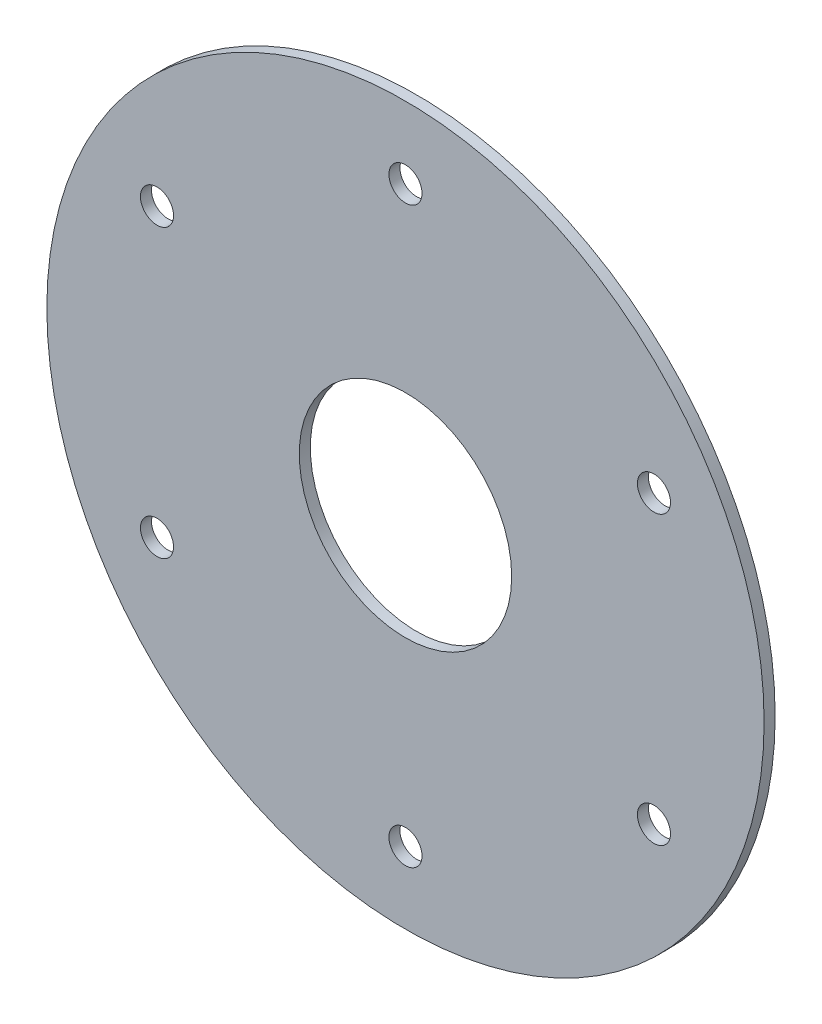
ISO-10303-21;
HEADER;
FILE_DESCRIPTION(('STEP AP214'),'2;1');
FILE_NAME('part.step','',(''),(''),'','','');
FILE_SCHEMA(('AUTOMOTIVE_DESIGN { 1 0 10303 214 1 1 1 1 }'));
ENDSEC;
DATA;
#1=APPLICATION_CONTEXT('core data for automotive mechanical design processes');
#2=APPLICATION_PROTOCOL_DEFINITION('international standard','automotive_design',2000,#1);
#3=PRODUCT_CONTEXT('',#1,'mechanical');
#4=PRODUCT('Part','Part','',(#3));
#5=PRODUCT_RELATED_PRODUCT_CATEGORY('part','',(#4));
#6=PRODUCT_DEFINITION_FORMATION('','',#4);
#7=PRODUCT_DEFINITION_CONTEXT('part definition',#1,'design');
#8=PRODUCT_DEFINITION('design','',#6,#7);
#9=PRODUCT_DEFINITION_SHAPE('','',#8);
#10=(LENGTH_UNIT() NAMED_UNIT(*) SI_UNIT(.MILLI.,.METRE.));
#11=(NAMED_UNIT(*) PLANE_ANGLE_UNIT() SI_UNIT($,.RADIAN.));
#12=(NAMED_UNIT(*) SI_UNIT($,.STERADIAN.) SOLID_ANGLE_UNIT());
#13=UNCERTAINTY_MEASURE_WITH_UNIT(LENGTH_MEASURE(1.E-05),#10,'distance_accuracy_value','');
#14=(GEOMETRIC_REPRESENTATION_CONTEXT(3) GLOBAL_UNCERTAINTY_ASSIGNED_CONTEXT((#13)) GLOBAL_UNIT_ASSIGNED_CONTEXT((#10,
#11,#12)) REPRESENTATION_CONTEXT('',''));
#15=CARTESIAN_POINT('',(0.,0.,0.));
#16=DIRECTION('',(0.,0.,1.));
#17=DIRECTION('',(1.,0.,0.));
#18=AXIS2_PLACEMENT_3D('',#15,#16,#17);
#19=CARTESIAN_POINT('',(0.,0.,4.));
#20=DIRECTION('',(0.,0.,1.));
#21=DIRECTION('',(1.,0.,0.));
#22=AXIS2_PLACEMENT_3D('',#19,#20,#21);
#23=PLANE('',#22);
#24=CARTESIAN_POINT('',(-90.0666419935594,-52.0000000000128,4.));
#25=DIRECTION('',(0.,0.,1.));
#26=DIRECTION('',(1.,0.,0.));
#27=AXIS2_PLACEMENT_3D('',#24,#25,#26);
#28=CIRCLE('',#27,6.00000000002588);
#29=CARTESIAN_POINT('',(-84.0666419935336,-52.0000000000128,4.));
#30=VERTEX_POINT('',#29);
#31=EDGE_CURVE('E75',#30,#30,#28,.T.);
#32=ORIENTED_EDGE('',*,*,#31,.F.);
#33=EDGE_LOOP('',(#32));
#34=FACE_BOUND('',#33,.T.);
#35=CARTESIAN_POINT('',(90.0666419936038,-51.9999999999872,4.));
#36=DIRECTION('',(0.,0.,1.));
#37=DIRECTION('',(1.,0.,0.));
#38=AXIS2_PLACEMENT_3D('',#35,#36,#37);
#39=CIRCLE('',#38,6.00000000001791);
#40=CARTESIAN_POINT('',(96.0666419936217,-51.9999999999872,4.));
#41=VERTEX_POINT('',#40);
#42=EDGE_CURVE('E63',#41,#41,#39,.T.);
#43=ORIENTED_EDGE('',*,*,#42,.F.);
#44=EDGE_LOOP('',(#43));
#45=FACE_BOUND('',#44,.T.);
#46=CARTESIAN_POINT('',(0.,104.,4.));
#47=DIRECTION('',(0.,0.,1.));
#48=DIRECTION('',(1.,0.,0.));
#49=AXIS2_PLACEMENT_3D('',#46,#47,#48);
#50=CIRCLE('',#49,6.);
#51=CARTESIAN_POINT('',(6.,104.,4.));
#52=VERTEX_POINT('',#51);
#53=EDGE_CURVE('E51',#52,#52,#50,.T.);
#54=ORIENTED_EDGE('',*,*,#53,.F.);
#55=EDGE_LOOP('',(#54));
#56=FACE_BOUND('',#55,.T.);
#57=CARTESIAN_POINT('',(0.,0.,4.));
#58=DIRECTION('',(0.,0.,1.));
#59=DIRECTION('',(1.,0.,0.));
#60=AXIS2_PLACEMENT_3D('',#57,#58,#59);
#61=CIRCLE('',#60,130.);
#62=CARTESIAN_POINT('',(130.,0.,4.));
#63=VERTEX_POINT('',#62);
#64=EDGE_CURVE('E10',#63,#63,#61,.T.);
#65=ORIENTED_EDGE('',*,*,#64,.T.);
#66=EDGE_LOOP('',(#65));
#67=FACE_BOUND('',#66,.T.);
#68=CARTESIAN_POINT('',(0.,0.,4.));
#69=DIRECTION('',(0.,0.,1.));
#70=DIRECTION('',(1.,0.,0.));
#71=AXIS2_PLACEMENT_3D('',#68,#69,#70);
#72=CIRCLE('',#71,38.5);
#73=CARTESIAN_POINT('',(38.5,0.,4.));
#74=VERTEX_POINT('',#73);
#75=EDGE_CURVE('E46',#74,#74,#72,.T.);
#76=ORIENTED_EDGE('',*,*,#75,.F.);
#77=EDGE_LOOP('',(#76));
#78=FACE_BOUND('',#77,.T.);
#79=CARTESIAN_POINT('',(90.0666419935889,52.0000000000128,4.));
#80=DIRECTION('',(0.,0.,1.));
#81=DIRECTION('',(1.,0.,0.));
#82=AXIS2_PLACEMENT_3D('',#79,#80,#81);
#83=CIRCLE('',#82,6.00000000000359);
#84=CARTESIAN_POINT('',(96.0666419935926,52.0000000000128,4.));
#85=VERTEX_POINT('',#84);
#86=EDGE_CURVE('E57',#85,#85,#83,.T.);
#87=ORIENTED_EDGE('',*,*,#86,.F.);
#88=EDGE_LOOP('',(#87));
#89=FACE_BOUND('',#88,.T.);
#90=CARTESIAN_POINT('',(2.95203688274868E-11,-104.,4.));
#91=DIRECTION('',(0.,0.,1.));
#92=DIRECTION('',(1.,0.,0.));
#93=AXIS2_PLACEMENT_3D('',#90,#91,#92);
#94=CIRCLE('',#93,6.00000000002893);
#95=CARTESIAN_POINT('',(6.00000000005845,-104.,4.));
#96=VERTEX_POINT('',#95);
#97=EDGE_CURVE('E69',#96,#96,#94,.T.);
#98=ORIENTED_EDGE('',*,*,#97,.F.);
#99=EDGE_LOOP('',(#98));
#100=FACE_BOUND('',#99,.T.);
#101=CARTESIAN_POINT('',(-90.0666419935743,51.9999999999871,4.));
#102=DIRECTION('',(0.,0.,1.));
#103=DIRECTION('',(1.,0.,0.));
#104=AXIS2_PLACEMENT_3D('',#101,#102,#103);
#105=CIRCLE('',#104,6.00000000001203);
#106=CARTESIAN_POINT('',(-84.0666419935622,51.9999999999871,4.));
#107=VERTEX_POINT('',#106);
#108=EDGE_CURVE('E81',#107,#107,#105,.T.);
#109=ORIENTED_EDGE('',*,*,#108,.F.);
#110=EDGE_LOOP('',(#109));
#111=FACE_BOUND('',#110,.T.);
#112=ADVANCED_FACE('F35',(#34,#45,#56,#67,#78,#89,#100,#111),#23,.T.);
#113=CARTESIAN_POINT('',(0.,0.,0.));
#114=DIRECTION('',(0.,0.,1.));
#115=DIRECTION('',(1.,0.,0.));
#116=AXIS2_PLACEMENT_3D('',#113,#114,#115);
#117=PLANE('',#116);
#118=CARTESIAN_POINT('',(0.,0.,0.));
#119=DIRECTION('',(0.,0.,1.));
#120=DIRECTION('',(1.,0.,0.));
#121=AXIS2_PLACEMENT_3D('',#118,#119,#120);
#122=CIRCLE('',#121,130.);
#123=CARTESIAN_POINT('',(130.,0.,0.));
#124=VERTEX_POINT('',#123);
#125=EDGE_CURVE('E39',#124,#124,#122,.T.);
#126=ORIENTED_EDGE('',*,*,#125,.F.);
#127=EDGE_LOOP('',(#126));
#128=FACE_BOUND('',#127,.T.);
#129=CARTESIAN_POINT('',(0.,0.,0.));
#130=DIRECTION('',(0.,0.,1.));
#131=DIRECTION('',(1.,0.,0.));
#132=AXIS2_PLACEMENT_3D('',#129,#130,#131);
#133=CIRCLE('',#132,38.5);
#134=CARTESIAN_POINT('',(38.5,0.,0.));
#135=VERTEX_POINT('',#134);
#136=EDGE_CURVE('E48',#135,#135,#133,.T.);
#137=ORIENTED_EDGE('',*,*,#136,.T.);
#138=EDGE_LOOP('',(#137));
#139=FACE_BOUND('',#138,.T.);
#140=CARTESIAN_POINT('',(0.,104.,0.));
#141=DIRECTION('',(0.,0.,1.));
#142=DIRECTION('',(1.,0.,0.));
#143=AXIS2_PLACEMENT_3D('',#140,#141,#142);
#144=CIRCLE('',#143,6.);
#145=CARTESIAN_POINT('',(6.,104.,0.));
#146=VERTEX_POINT('',#145);
#147=EDGE_CURVE('E54',#146,#146,#144,.T.);
#148=ORIENTED_EDGE('',*,*,#147,.T.);
#149=EDGE_LOOP('',(#148));
#150=FACE_BOUND('',#149,.T.);
#151=CARTESIAN_POINT('',(90.0666419935889,52.0000000000128,0.));
#152=DIRECTION('',(0.,0.,1.));
#153=DIRECTION('',(1.,0.,0.));
#154=AXIS2_PLACEMENT_3D('',#151,#152,#153);
#155=CIRCLE('',#154,6.00000000000359);
#156=CARTESIAN_POINT('',(96.0666419935926,52.0000000000128,0.));
#157=VERTEX_POINT('',#156);
#158=EDGE_CURVE('E60',#157,#157,#155,.T.);
#159=ORIENTED_EDGE('',*,*,#158,.T.);
#160=EDGE_LOOP('',(#159));
#161=FACE_BOUND('',#160,.T.);
#162=CARTESIAN_POINT('',(90.0666419936038,-51.9999999999872,0.));
#163=DIRECTION('',(0.,0.,1.));
#164=DIRECTION('',(1.,0.,0.));
#165=AXIS2_PLACEMENT_3D('',#162,#163,#164);
#166=CIRCLE('',#165,6.00000000001791);
#167=CARTESIAN_POINT('',(96.0666419936217,-51.9999999999872,0.));
#168=VERTEX_POINT('',#167);
#169=EDGE_CURVE('E66',#168,#168,#166,.T.);
#170=ORIENTED_EDGE('',*,*,#169,.T.);
#171=EDGE_LOOP('',(#170));
#172=FACE_BOUND('',#171,.T.);
#173=CARTESIAN_POINT('',(2.95203688274868E-11,-104.,0.));
#174=DIRECTION('',(0.,0.,1.));
#175=DIRECTION('',(1.,0.,0.));
#176=AXIS2_PLACEMENT_3D('',#173,#174,#175);
#177=CIRCLE('',#176,6.00000000002893);
#178=CARTESIAN_POINT('',(6.00000000005845,-104.,0.));
#179=VERTEX_POINT('',#178);
#180=EDGE_CURVE('E72',#179,#179,#177,.T.);
#181=ORIENTED_EDGE('',*,*,#180,.T.);
#182=EDGE_LOOP('',(#181));
#183=FACE_BOUND('',#182,.T.);
#184=CARTESIAN_POINT('',(-90.0666419935594,-52.0000000000128,0.));
#185=DIRECTION('',(0.,0.,1.));
#186=DIRECTION('',(1.,0.,0.));
#187=AXIS2_PLACEMENT_3D('',#184,#185,#186);
#188=CIRCLE('',#187,6.00000000002588);
#189=CARTESIAN_POINT('',(-84.0666419935336,-52.0000000000128,0.));
#190=VERTEX_POINT('',#189);
#191=EDGE_CURVE('E78',#190,#190,#188,.T.);
#192=ORIENTED_EDGE('',*,*,#191,.T.);
#193=EDGE_LOOP('',(#192));
#194=FACE_BOUND('',#193,.T.);
#195=CARTESIAN_POINT('',(-90.0666419935743,51.9999999999871,0.));
#196=DIRECTION('',(0.,0.,1.));
#197=DIRECTION('',(1.,0.,0.));
#198=AXIS2_PLACEMENT_3D('',#195,#196,#197);
#199=CIRCLE('',#198,6.00000000001203);
#200=CARTESIAN_POINT('',(-84.0666419935622,51.9999999999871,0.));
#201=VERTEX_POINT('',#200);
#202=EDGE_CURVE('E84',#201,#201,#199,.T.);
#203=ORIENTED_EDGE('',*,*,#202,.T.);
#204=EDGE_LOOP('',(#203));
#205=FACE_BOUND('',#204,.T.);
#206=ADVANCED_FACE('F94',(#128,#139,#150,#161,#172,#183,#194,#205),#117,.F.);
#207=CARTESIAN_POINT('',(0.,0.,4.));
#208=DIRECTION('',(0.,0.,-1.));
#209=DIRECTION('',(-1.,0.,0.));
#210=AXIS2_PLACEMENT_3D('',#207,#208,#209);
#211=CYLINDRICAL_SURFACE('',#210,130.);
#212=ORIENTED_EDGE('',*,*,#64,.F.);
#213=EDGE_LOOP('',(#212));
#214=FACE_BOUND('',#213,.T.);
#215=ORIENTED_EDGE('',*,*,#125,.T.);
#216=EDGE_LOOP('',(#215));
#217=FACE_BOUND('',#216,.T.);
#218=ADVANCED_FACE('F37',(#214,#217),#211,.T.);
#219=CARTESIAN_POINT('',(0.,0.,4.));
#220=DIRECTION('',(0.,0.,-1.));
#221=DIRECTION('',(-1.,0.,0.));
#222=AXIS2_PLACEMENT_3D('',#219,#220,#221);
#223=CYLINDRICAL_SURFACE('',#222,38.5);
#224=ORIENTED_EDGE('',*,*,#75,.T.);
#225=EDGE_LOOP('',(#224));
#226=FACE_BOUND('',#225,.T.);
#227=ORIENTED_EDGE('',*,*,#136,.F.);
#228=EDGE_LOOP('',(#227));
#229=FACE_BOUND('',#228,.T.);
#230=ADVANCED_FACE('F104',(#226,#229),#223,.F.);
#231=CARTESIAN_POINT('',(0.,104.,4.));
#232=DIRECTION('',(0.,0.,-1.));
#233=DIRECTION('',(-1.,0.,0.));
#234=AXIS2_PLACEMENT_3D('',#231,#232,#233);
#235=CYLINDRICAL_SURFACE('',#234,6.);
#236=ORIENTED_EDGE('',*,*,#53,.T.);
#237=EDGE_LOOP('',(#236));
#238=FACE_BOUND('',#237,.T.);
#239=ORIENTED_EDGE('',*,*,#147,.F.);
#240=EDGE_LOOP('',(#239));
#241=FACE_BOUND('',#240,.T.);
#242=ADVANCED_FACE('F107',(#238,#241),#235,.F.);
#243=CARTESIAN_POINT('',(90.0666419935889,52.0000000000128,4.));
#244=DIRECTION('',(0.,0.,-1.));
#245=DIRECTION('',(-1.,0.,0.));
#246=AXIS2_PLACEMENT_3D('',#243,#244,#245);
#247=CYLINDRICAL_SURFACE('',#246,6.00000000000359);
#248=ORIENTED_EDGE('',*,*,#86,.T.);
#249=EDGE_LOOP('',(#248));
#250=FACE_BOUND('',#249,.T.);
#251=ORIENTED_EDGE('',*,*,#158,.F.);
#252=EDGE_LOOP('',(#251));
#253=FACE_BOUND('',#252,.T.);
#254=ADVANCED_FACE('F111',(#250,#253),#247,.F.);
#255=CARTESIAN_POINT('',(90.0666419936038,-51.9999999999872,4.));
#256=DIRECTION('',(0.,0.,-1.));
#257=DIRECTION('',(-1.,0.,0.));
#258=AXIS2_PLACEMENT_3D('',#255,#256,#257);
#259=CYLINDRICAL_SURFACE('',#258,6.00000000001791);
#260=ORIENTED_EDGE('',*,*,#42,.T.);
#261=EDGE_LOOP('',(#260));
#262=FACE_BOUND('',#261,.T.);
#263=ORIENTED_EDGE('',*,*,#169,.F.);
#264=EDGE_LOOP('',(#263));
#265=FACE_BOUND('',#264,.T.);
#266=ADVANCED_FACE('F115',(#262,#265),#259,.F.);
#267=CARTESIAN_POINT('',(2.95203688274868E-11,-104.,4.));
#268=DIRECTION('',(0.,0.,-1.));
#269=DIRECTION('',(-1.,0.,0.));
#270=AXIS2_PLACEMENT_3D('',#267,#268,#269);
#271=CYLINDRICAL_SURFACE('',#270,6.00000000002893);
#272=ORIENTED_EDGE('',*,*,#97,.T.);
#273=EDGE_LOOP('',(#272));
#274=FACE_BOUND('',#273,.T.);
#275=ORIENTED_EDGE('',*,*,#180,.F.);
#276=EDGE_LOOP('',(#275));
#277=FACE_BOUND('',#276,.T.);
#278=ADVANCED_FACE('F119',(#274,#277),#271,.F.);
#279=CARTESIAN_POINT('',(-90.0666419935594,-52.0000000000128,4.));
#280=DIRECTION('',(0.,0.,-1.));
#281=DIRECTION('',(-1.,0.,0.));
#282=AXIS2_PLACEMENT_3D('',#279,#280,#281);
#283=CYLINDRICAL_SURFACE('',#282,6.00000000002588);
#284=ORIENTED_EDGE('',*,*,#31,.T.);
#285=EDGE_LOOP('',(#284));
#286=FACE_BOUND('',#285,.T.);
#287=ORIENTED_EDGE('',*,*,#191,.F.);
#288=EDGE_LOOP('',(#287));
#289=FACE_BOUND('',#288,.T.);
#290=ADVANCED_FACE('F123',(#286,#289),#283,.F.);
#291=CARTESIAN_POINT('',(-90.0666419935743,51.9999999999871,4.));
#292=DIRECTION('',(0.,0.,-1.));
#293=DIRECTION('',(-1.,0.,0.));
#294=AXIS2_PLACEMENT_3D('',#291,#292,#293);
#295=CYLINDRICAL_SURFACE('',#294,6.00000000001203);
#296=ORIENTED_EDGE('',*,*,#108,.T.);
#297=EDGE_LOOP('',(#296));
#298=FACE_BOUND('',#297,.T.);
#299=ORIENTED_EDGE('',*,*,#202,.F.);
#300=EDGE_LOOP('',(#299));
#301=FACE_BOUND('',#300,.T.);
#302=ADVANCED_FACE('F90',(#298,#301),#295,.F.);
#303=CLOSED_SHELL('',(#112,#206,#218,#230,#242,#254,#266,#278,#290,#302));
#304=MANIFOLD_SOLID_BREP('B2',#303);
#305=ADVANCED_BREP_SHAPE_REPRESENTATION('',(#18,#304),#14);
#306=SHAPE_DEFINITION_REPRESENTATION(#9,#305);
ENDSEC;
END-ISO-10303-21;
